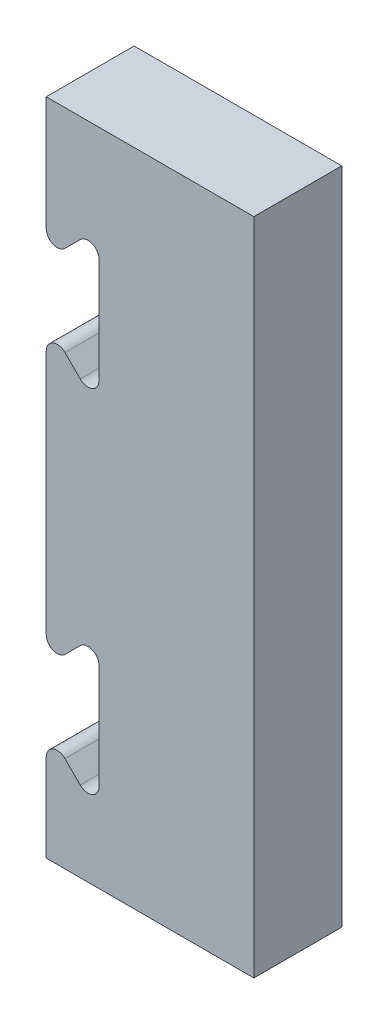
ISO-10303-21;
HEADER;
FILE_DESCRIPTION(('STEP AP214'),'2;1');
FILE_NAME('part.step','',(''),(''),'','','');
FILE_SCHEMA(('AUTOMOTIVE_DESIGN { 1 0 10303 214 1 1 1 1 }'));
ENDSEC;
DATA;
#1=APPLICATION_CONTEXT('core data for automotive mechanical design processes');
#2=APPLICATION_PROTOCOL_DEFINITION('international standard','automotive_design',2000,#1);
#3=PRODUCT_CONTEXT('',#1,'mechanical');
#4=PRODUCT('Part','Part','',(#3));
#5=PRODUCT_RELATED_PRODUCT_CATEGORY('part','',(#4));
#6=PRODUCT_DEFINITION_FORMATION('','',#4);
#7=PRODUCT_DEFINITION_CONTEXT('part definition',#1,'design');
#8=PRODUCT_DEFINITION('design','',#6,#7);
#9=PRODUCT_DEFINITION_SHAPE('','',#8);
#10=(LENGTH_UNIT() NAMED_UNIT(*) SI_UNIT(.MILLI.,.METRE.));
#11=(NAMED_UNIT(*) PLANE_ANGLE_UNIT() SI_UNIT($,.RADIAN.));
#12=(NAMED_UNIT(*) SI_UNIT($,.STERADIAN.) SOLID_ANGLE_UNIT());
#13=UNCERTAINTY_MEASURE_WITH_UNIT(LENGTH_MEASURE(1.E-05),#10,'distance_accuracy_value','');
#14=(GEOMETRIC_REPRESENTATION_CONTEXT(3) GLOBAL_UNCERTAINTY_ASSIGNED_CONTEXT((#13)) GLOBAL_UNIT_ASSIGNED_CONTEXT((#10,
#11,#12)) REPRESENTATION_CONTEXT('',''));
#15=CARTESIAN_POINT('',(0.,0.,0.));
#16=DIRECTION('',(0.,0.,1.));
#17=DIRECTION('',(1.,0.,0.));
#18=AXIS2_PLACEMENT_3D('',#15,#16,#17);
#19=CARTESIAN_POINT('',(0.,0.,-10.));
#20=DIRECTION('',(0.,-1.,0.));
#21=DIRECTION('',(0.,0.,-1.));
#22=AXIS2_PLACEMENT_3D('',#19,#20,#21);
#23=PLANE('',#22);
#24=DIRECTION('',(0.,0.,1.));
#25=VECTOR('',#24,1.);
#26=CARTESIAN_POINT('',(23.6143862190611,0.,-191.676734449803));
#27=LINE('',#26,#25);
#28=CARTESIAN_POINT('',(23.6143862190611,0.,-10.));
#29=VERTEX_POINT('',#28);
#30=CARTESIAN_POINT('',(23.6143862190611,0.,0.));
#31=VERTEX_POINT('',#30);
#32=EDGE_CURVE('E214',#29,#31,#27,.T.);
#33=ORIENTED_EDGE('',*,*,#32,.T.);
#34=DIRECTION('',(1.,0.,0.));
#35=VECTOR('',#34,1.);
#36=CARTESIAN_POINT('',(0.,0.,0.));
#37=LINE('',#36,#35);
#38=CARTESIAN_POINT('',(0.,0.,0.));
#39=VERTEX_POINT('',#38);
#40=EDGE_CURVE('E210',#39,#31,#37,.T.);
#41=ORIENTED_EDGE('',*,*,#40,.F.);
#42=DIRECTION('',(0.,0.,1.));
#43=VECTOR('',#42,1.);
#44=CARTESIAN_POINT('',(0.,0.,-10.));
#45=LINE('',#44,#43);
#46=CARTESIAN_POINT('',(0.,0.,-10.));
#47=VERTEX_POINT('',#46);
#48=EDGE_CURVE('E198',#47,#39,#45,.T.);
#49=ORIENTED_EDGE('',*,*,#48,.F.);
#50=DIRECTION('',(1.,0.,0.));
#51=VECTOR('',#50,1.);
#52=CARTESIAN_POINT('',(0.,0.,-10.));
#53=LINE('',#52,#51);
#54=EDGE_CURVE('E209',#47,#29,#53,.T.);
#55=ORIENTED_EDGE('',*,*,#54,.T.);
#56=EDGE_LOOP('',(#33,#41,#49,#55));
#57=FACE_BOUND('',#56,.T.);
#58=ADVANCED_FACE('F34',(#57),#23,.T.);
#59=CARTESIAN_POINT('',(0.,120.,-10.));
#60=DIRECTION('',(-1.,0.,0.));
#61=DIRECTION('',(0.,-1.,0.));
#62=AXIS2_PLACEMENT_3D('',#59,#60,#61);
#63=PLANE('',#62);
#64=DIRECTION('',(0.,-1.,0.));
#65=VECTOR('',#64,1.);
#66=CARTESIAN_POINT('',(0.,120.,0.));
#67=LINE('',#66,#65);
#68=CARTESIAN_POINT('',(0.,9.98223304703363,0.));
#69=VERTEX_POINT('',#68);
#70=EDGE_CURVE('E82',#69,#39,#67,.T.);
#71=ORIENTED_EDGE('',*,*,#70,.F.);
#72=DIRECTION('',(0.,0.,1.));
#73=VECTOR('',#72,1.);
#74=CARTESIAN_POINT('',(0.,9.98223304703363,-10.));
#75=LINE('',#74,#73);
#76=CARTESIAN_POINT('',(0.,9.98223304703363,-10.));
#77=VERTEX_POINT('',#76);
#78=EDGE_CURVE('E193',#69,#77,#75,.F.);
#79=ORIENTED_EDGE('',*,*,#78,.T.);
#80=DIRECTION('',(0.,-1.,0.));
#81=VECTOR('',#80,1.);
#82=CARTESIAN_POINT('',(0.,120.,-10.));
#83=LINE('',#82,#81);
#84=EDGE_CURVE('E195',#77,#47,#83,.T.);
#85=ORIENTED_EDGE('',*,*,#84,.T.);
#86=ORIENTED_EDGE('',*,*,#48,.T.);
#87=EDGE_LOOP('',(#71,#79,#85,#86));
#88=FACE_BOUND('',#87,.T.);
#89=ADVANCED_FACE('F197',(#88),#63,.T.);
#90=CARTESIAN_POINT('',(1.25,9.98223304703363,-10.));
#91=DIRECTION('',(0.,0.,-1.));
#92=DIRECTION('',(-1.,0.,0.));
#93=AXIS2_PLACEMENT_3D('',#90,#91,#92);
#94=CYLINDRICAL_SURFACE('',#93,1.25);
#95=CARTESIAN_POINT('',(1.25,9.98223304703363,-10.));
#96=DIRECTION('',(0.,0.,1.));
#97=DIRECTION('',(1.,0.,0.));
#98=AXIS2_PLACEMENT_3D('',#95,#96,#97);
#99=CIRCLE('',#98,1.25);
#100=CARTESIAN_POINT('',(2.13388347648318,10.8661165235168,-10.));
#101=VERTEX_POINT('',#100);
#102=EDGE_CURVE('E270',#77,#101,#99,.F.);
#103=ORIENTED_EDGE('',*,*,#102,.F.);
#104=ORIENTED_EDGE('',*,*,#78,.F.);
#105=CARTESIAN_POINT('',(1.25,9.98223304703363,0.));
#106=DIRECTION('',(0.,0.,1.));
#107=DIRECTION('',(1.,0.,0.));
#108=AXIS2_PLACEMENT_3D('',#105,#106,#107);
#109=CIRCLE('',#108,1.25);
#110=CARTESIAN_POINT('',(2.13388347648318,10.8661165235168,0.));
#111=VERTEX_POINT('',#110);
#112=EDGE_CURVE('E90',#111,#69,#109,.T.);
#113=ORIENTED_EDGE('',*,*,#112,.F.);
#114=DIRECTION('',(0.,0.,1.));
#115=VECTOR('',#114,1.);
#116=CARTESIAN_POINT('',(2.13388347648318,10.8661165235168,0.));
#117=LINE('',#116,#115);
#118=EDGE_CURVE('E255',#101,#111,#117,.T.);
#119=ORIENTED_EDGE('',*,*,#118,.F.);
#120=EDGE_LOOP('',(#103,#104,#113,#119));
#121=FACE_BOUND('',#120,.T.);
#122=ADVANCED_FACE('F377',(#121),#94,.T.);
#123=CARTESIAN_POINT('',(0.,13.,-10.));
#124=DIRECTION('',(-0.707106781186548,-0.707106781186547,0.));
#125=DIRECTION('',(0.707106781186547,-0.707106781186548,0.));
#126=AXIS2_PLACEMENT_3D('',#123,#124,#125);
#127=PLANE('',#126);
#128=DIRECTION('',(0.707106781186547,-0.707106781186548,0.));
#129=VECTOR('',#128,1.);
#130=CARTESIAN_POINT('',(0.,13.,0.));
#131=LINE('',#130,#129);
#132=CARTESIAN_POINT('',(3.86611652351681,9.13388347648318,0.));
#133=VERTEX_POINT('',#132);
#134=EDGE_CURVE('E211',#111,#133,#131,.T.);
#135=ORIENTED_EDGE('',*,*,#134,.T.);
#136=DIRECTION('',(0.,0.,1.));
#137=VECTOR('',#136,1.);
#138=CARTESIAN_POINT('',(3.86611652351681,9.13388347648318,-10.));
#139=LINE('',#138,#137);
#140=CARTESIAN_POINT('',(3.86611652351681,9.13388347648318,-10.));
#141=VERTEX_POINT('',#140);
#142=EDGE_CURVE('E258',#133,#141,#139,.F.);
#143=ORIENTED_EDGE('',*,*,#142,.T.);
#144=DIRECTION('',(0.707106781186547,-0.707106781186548,0.));
#145=VECTOR('',#144,1.);
#146=CARTESIAN_POINT('',(0.,13.,-10.));
#147=LINE('',#146,#145);
#148=EDGE_CURVE('E268',#101,#141,#147,.T.);
#149=ORIENTED_EDGE('',*,*,#148,.F.);
#150=ORIENTED_EDGE('',*,*,#118,.T.);
#151=EDGE_LOOP('',(#135,#143,#149,#150));
#152=FACE_BOUND('',#151,.T.);
#153=ADVANCED_FACE('F389',(#152),#127,.F.);
#154=CARTESIAN_POINT('',(4.75,10.0177669529664,-10.));
#155=DIRECTION('',(0.,0.,-1.));
#156=DIRECTION('',(-1.,0.,0.));
#157=AXIS2_PLACEMENT_3D('',#154,#155,#156);
#158=CYLINDRICAL_SURFACE('',#157,1.25);
#159=CARTESIAN_POINT('',(4.75,10.0177669529664,-10.));
#160=DIRECTION('',(0.,0.,1.));
#161=DIRECTION('',(1.,0.,0.));
#162=AXIS2_PLACEMENT_3D('',#159,#160,#161);
#163=CIRCLE('',#162,1.25);
#164=CARTESIAN_POINT('',(6.,10.0177669529664,-10.));
#165=VERTEX_POINT('',#164);
#166=EDGE_CURVE('E267',#141,#165,#163,.T.);
#167=ORIENTED_EDGE('',*,*,#166,.F.);
#168=ORIENTED_EDGE('',*,*,#142,.F.);
#169=CARTESIAN_POINT('',(4.75,10.0177669529664,0.));
#170=DIRECTION('',(0.,0.,1.));
#171=DIRECTION('',(1.,0.,0.));
#172=AXIS2_PLACEMENT_3D('',#169,#170,#171);
#173=CIRCLE('',#172,1.25);
#174=CARTESIAN_POINT('',(6.,10.0177669529664,0.));
#175=VERTEX_POINT('',#174);
#176=EDGE_CURVE('E301',#175,#133,#173,.F.);
#177=ORIENTED_EDGE('',*,*,#176,.F.);
#178=DIRECTION('',(0.,0.,1.));
#179=VECTOR('',#178,1.);
#180=CARTESIAN_POINT('',(6.,10.0177669529664,0.));
#181=LINE('',#180,#179);
#182=EDGE_CURVE('E313',#165,#175,#181,.T.);
#183=ORIENTED_EDGE('',*,*,#182,.F.);
#184=EDGE_LOOP('',(#167,#168,#177,#183));
#185=FACE_BOUND('',#184,.T.);
#186=ADVANCED_FACE('F392',(#185),#158,.F.);
#187=CARTESIAN_POINT('',(6.,6.99999999999999,-10.));
#188=DIRECTION('',(1.,0.,0.));
#189=DIRECTION('',(0.,0.,-1.));
#190=AXIS2_PLACEMENT_3D('',#187,#188,#189);
#191=PLANE('',#190);
#192=DIRECTION('',(0.,1.,0.));
#193=VECTOR('',#192,1.);
#194=CARTESIAN_POINT('',(6.,6.99999999999999,0.));
#195=LINE('',#194,#193);
#196=CARTESIAN_POINT('',(6.,21.9822330470336,0.));
#197=VERTEX_POINT('',#196);
#198=EDGE_CURVE('E251',#175,#197,#195,.T.);
#199=ORIENTED_EDGE('',*,*,#198,.T.);
#200=DIRECTION('',(0.,0.,1.));
#201=VECTOR('',#200,1.);
#202=CARTESIAN_POINT('',(6.,21.9822330470336,-10.));
#203=LINE('',#202,#201);
#204=CARTESIAN_POINT('',(6.,21.9822330470336,-10.));
#205=VERTEX_POINT('',#204);
#206=EDGE_CURVE('E254',#197,#205,#203,.F.);
#207=ORIENTED_EDGE('',*,*,#206,.T.);
#208=DIRECTION('',(0.,1.,0.));
#209=VECTOR('',#208,1.);
#210=CARTESIAN_POINT('',(6.,6.99999999999999,-10.));
#211=LINE('',#210,#209);
#212=EDGE_CURVE('E264',#165,#205,#211,.T.);
#213=ORIENTED_EDGE('',*,*,#212,.F.);
#214=ORIENTED_EDGE('',*,*,#182,.T.);
#215=EDGE_LOOP('',(#199,#207,#213,#214));
#216=FACE_BOUND('',#215,.T.);
#217=ADVANCED_FACE('F394',(#216),#191,.F.);
#218=CARTESIAN_POINT('',(4.75,21.9822330470336,-10.));
#219=DIRECTION('',(0.,0.,-1.));
#220=DIRECTION('',(-1.,0.,0.));
#221=AXIS2_PLACEMENT_3D('',#218,#219,#220);
#222=CYLINDRICAL_SURFACE('',#221,1.25);
#223=CARTESIAN_POINT('',(4.75,21.9822330470336,-10.));
#224=DIRECTION('',(0.,0.,1.));
#225=DIRECTION('',(1.,0.,0.));
#226=AXIS2_PLACEMENT_3D('',#223,#224,#225);
#227=CIRCLE('',#226,1.25);
#228=CARTESIAN_POINT('',(3.86611652351681,22.8661165235168,-10.));
#229=VERTEX_POINT('',#228);
#230=EDGE_CURVE('E263',#205,#229,#227,.T.);
#231=ORIENTED_EDGE('',*,*,#230,.F.);
#232=ORIENTED_EDGE('',*,*,#206,.F.);
#233=CARTESIAN_POINT('',(4.75,21.9822330470336,0.));
#234=DIRECTION('',(0.,0.,1.));
#235=DIRECTION('',(1.,0.,0.));
#236=AXIS2_PLACEMENT_3D('',#233,#234,#235);
#237=CIRCLE('',#236,1.25);
#238=CARTESIAN_POINT('',(3.86611652351681,22.8661165235168,0.));
#239=VERTEX_POINT('',#238);
#240=EDGE_CURVE('E303',#239,#197,#237,.F.);
#241=ORIENTED_EDGE('',*,*,#240,.F.);
#242=DIRECTION('',(0.,0.,1.));
#243=VECTOR('',#242,1.);
#244=CARTESIAN_POINT('',(3.86611652351681,22.8661165235168,0.));
#245=LINE('',#244,#243);
#246=EDGE_CURVE('E250',#229,#239,#245,.T.);
#247=ORIENTED_EDGE('',*,*,#246,.F.);
#248=EDGE_LOOP('',(#231,#232,#241,#247));
#249=FACE_BOUND('',#248,.T.);
#250=ADVANCED_FACE('F380',(#249),#222,.F.);
#251=CARTESIAN_POINT('',(6.,25.,-10.));
#252=DIRECTION('',(-0.707106781186547,0.707106781186548,0.));
#253=DIRECTION('',(-0.707106781186548,-0.707106781186547,0.));
#254=AXIS2_PLACEMENT_3D('',#251,#252,#253);
#255=PLANE('',#254);
#256=DIRECTION('',(-0.707106781186548,-0.707106781186547,0.));
#257=VECTOR('',#256,1.);
#258=CARTESIAN_POINT('',(6.,25.,-10.));
#259=LINE('',#258,#257);
#260=CARTESIAN_POINT('',(2.13388347648318,21.1338834764832,-10.));
#261=VERTEX_POINT('',#260);
#262=EDGE_CURVE('E259',#229,#261,#259,.T.);
#263=ORIENTED_EDGE('',*,*,#262,.F.);
#264=ORIENTED_EDGE('',*,*,#246,.T.);
#265=DIRECTION('',(-0.707106781186548,-0.707106781186547,0.));
#266=VECTOR('',#265,1.);
#267=CARTESIAN_POINT('',(6.,25.,0.));
#268=LINE('',#267,#266);
#269=CARTESIAN_POINT('',(2.13388347648318,21.1338834764832,0.));
#270=VERTEX_POINT('',#269);
#271=EDGE_CURVE('E247',#239,#270,#268,.T.);
#272=ORIENTED_EDGE('',*,*,#271,.T.);
#273=DIRECTION('',(0.,0.,1.));
#274=VECTOR('',#273,1.);
#275=CARTESIAN_POINT('',(2.13388347648318,21.1338834764832,-10.));
#276=LINE('',#275,#274);
#277=EDGE_CURVE('E249',#270,#261,#276,.F.);
#278=ORIENTED_EDGE('',*,*,#277,.T.);
#279=EDGE_LOOP('',(#263,#264,#272,#278));
#280=FACE_BOUND('',#279,.T.);
#281=ADVANCED_FACE('F398',(#280),#255,.F.);
#282=CARTESIAN_POINT('',(1.25,22.0177669529664,-10.));
#283=DIRECTION('',(0.,0.,-1.));
#284=DIRECTION('',(-1.,0.,0.));
#285=AXIS2_PLACEMENT_3D('',#282,#283,#284);
#286=CYLINDRICAL_SURFACE('',#285,1.25);
#287=CARTESIAN_POINT('',(1.25,22.0177669529664,-10.));
#288=DIRECTION('',(0.,0.,1.));
#289=DIRECTION('',(1.,0.,0.));
#290=AXIS2_PLACEMENT_3D('',#287,#288,#289);
#291=CIRCLE('',#290,1.25);
#292=CARTESIAN_POINT('',(0.,22.0177669529664,-10.));
#293=VERTEX_POINT('',#292);
#294=EDGE_CURVE('E262',#261,#293,#291,.F.);
#295=ORIENTED_EDGE('',*,*,#294,.F.);
#296=ORIENTED_EDGE('',*,*,#277,.F.);
#297=CARTESIAN_POINT('',(1.25,22.0177669529664,0.));
#298=DIRECTION('',(0.,0.,1.));
#299=DIRECTION('',(1.,0.,0.));
#300=AXIS2_PLACEMENT_3D('',#297,#298,#299);
#301=CIRCLE('',#300,1.25);
#302=CARTESIAN_POINT('',(0.,22.0177669529664,0.));
#303=VERTEX_POINT('',#302);
#304=EDGE_CURVE('E130',#303,#270,#301,.T.);
#305=ORIENTED_EDGE('',*,*,#304,.F.);
#306=DIRECTION('',(0.,0.,1.));
#307=VECTOR('',#306,1.);
#308=CARTESIAN_POINT('',(0.,22.0177669529664,0.));
#309=LINE('',#308,#307);
#310=EDGE_CURVE('E291',#293,#303,#309,.T.);
#311=ORIENTED_EDGE('',*,*,#310,.F.);
#312=EDGE_LOOP('',(#295,#296,#305,#311));
#313=FACE_BOUND('',#312,.T.);
#314=ADVANCED_FACE('F401',(#313),#286,.T.);
#315=CARTESIAN_POINT('',(0.,49.9822330470336,-10.));
#316=VERTEX_POINT('',#315);
#317=EDGE_CURVE('E205',#316,#293,#83,.T.);
#318=ORIENTED_EDGE('',*,*,#317,.T.);
#319=ORIENTED_EDGE('',*,*,#310,.T.);
#320=CARTESIAN_POINT('',(0.,49.9822330470336,0.));
#321=VERTEX_POINT('',#320);
#322=EDGE_CURVE('E219',#321,#303,#67,.T.);
#323=ORIENTED_EDGE('',*,*,#322,.F.);
#324=DIRECTION('',(0.,0.,1.));
#325=VECTOR('',#324,1.);
#326=CARTESIAN_POINT('',(0.,49.9822330470336,-10.));
#327=LINE('',#326,#325);
#328=EDGE_CURVE('E226',#321,#316,#327,.F.);
#329=ORIENTED_EDGE('',*,*,#328,.T.);
#330=EDGE_LOOP('',(#318,#319,#323,#329));
#331=FACE_BOUND('',#330,.T.);
#332=ADVANCED_FACE('F324',(#331),#63,.T.);
#333=CARTESIAN_POINT('',(1.25,49.9822330470336,-10.));
#334=DIRECTION('',(0.,0.,-1.));
#335=DIRECTION('',(-1.,0.,0.));
#336=AXIS2_PLACEMENT_3D('',#333,#334,#335);
#337=CYLINDRICAL_SURFACE('',#336,1.25);
#338=CARTESIAN_POINT('',(1.25,49.9822330470336,-10.));
#339=DIRECTION('',(0.,0.,1.));
#340=DIRECTION('',(1.,0.,0.));
#341=AXIS2_PLACEMENT_3D('',#338,#339,#340);
#342=CIRCLE('',#341,1.25);
#343=CARTESIAN_POINT('',(2.13388347648318,50.8661165235168,-10.));
#344=VERTEX_POINT('',#343);
#345=EDGE_CURVE('E239',#316,#344,#342,.F.);
#346=ORIENTED_EDGE('',*,*,#345,.F.);
#347=ORIENTED_EDGE('',*,*,#328,.F.);
#348=CARTESIAN_POINT('',(1.25,49.9822330470336,0.));
#349=DIRECTION('',(0.,0.,1.));
#350=DIRECTION('',(1.,0.,0.));
#351=AXIS2_PLACEMENT_3D('',#348,#349,#350);
#352=CIRCLE('',#351,1.25);
#353=CARTESIAN_POINT('',(2.13388347648318,50.8661165235168,0.));
#354=VERTEX_POINT('',#353);
#355=EDGE_CURVE('E137',#354,#321,#352,.T.);
#356=ORIENTED_EDGE('',*,*,#355,.F.);
#357=DIRECTION('',(0.,0.,1.));
#358=VECTOR('',#357,1.);
#359=CARTESIAN_POINT('',(2.13388347648318,50.8661165235168,0.));
#360=LINE('',#359,#358);
#361=EDGE_CURVE('E285',#344,#354,#360,.T.);
#362=ORIENTED_EDGE('',*,*,#361,.F.);
#363=EDGE_LOOP('',(#346,#347,#356,#362));
#364=FACE_BOUND('',#363,.T.);
#365=ADVANCED_FACE('F329',(#364),#337,.T.);
#366=CARTESIAN_POINT('',(6.,47.,-10.));
#367=DIRECTION('',(-0.707106781186547,-0.707106781186548,0.));
#368=DIRECTION('',(0.707106781186548,-0.707106781186547,0.));
#369=AXIS2_PLACEMENT_3D('',#366,#367,#368);
#370=PLANE('',#369);
#371=DIRECTION('',(0.707106781186548,-0.707106781186547,0.));
#372=VECTOR('',#371,1.);
#373=CARTESIAN_POINT('',(6.,47.,0.));
#374=LINE('',#373,#372);
#375=CARTESIAN_POINT('',(3.86611652351681,49.1338834764832,0.));
#376=VERTEX_POINT('',#375);
#377=EDGE_CURVE('E222',#354,#376,#374,.T.);
#378=ORIENTED_EDGE('',*,*,#377,.T.);
#379=DIRECTION('',(0.,0.,1.));
#380=VECTOR('',#379,1.);
#381=CARTESIAN_POINT('',(3.86611652351681,49.1338834764832,-10.));
#382=LINE('',#381,#380);
#383=CARTESIAN_POINT('',(3.86611652351681,49.1338834764832,-10.));
#384=VERTEX_POINT('',#383);
#385=EDGE_CURVE('E225',#376,#384,#382,.F.);
#386=ORIENTED_EDGE('',*,*,#385,.T.);
#387=DIRECTION('',(0.707106781186548,-0.707106781186547,0.));
#388=VECTOR('',#387,1.);
#389=CARTESIAN_POINT('',(6.,47.,-10.));
#390=LINE('',#389,#388);
#391=EDGE_CURVE('E235',#344,#384,#390,.T.);
#392=ORIENTED_EDGE('',*,*,#391,.F.);
#393=ORIENTED_EDGE('',*,*,#361,.T.);
#394=EDGE_LOOP('',(#378,#386,#392,#393));
#395=FACE_BOUND('',#394,.T.);
#396=ADVANCED_FACE('F334',(#395),#370,.F.);
#397=CARTESIAN_POINT('',(4.75,50.0177669529664,-10.));
#398=DIRECTION('',(0.,0.,-1.));
#399=DIRECTION('',(-1.,0.,0.));
#400=AXIS2_PLACEMENT_3D('',#397,#398,#399);
#401=CYLINDRICAL_SURFACE('',#400,1.25);
#402=CARTESIAN_POINT('',(4.75,50.0177669529664,-10.));
#403=DIRECTION('',(0.,0.,1.));
#404=DIRECTION('',(1.,0.,0.));
#405=AXIS2_PLACEMENT_3D('',#402,#403,#404);
#406=CIRCLE('',#405,1.25);
#407=CARTESIAN_POINT('',(6.,50.0177669529664,-10.));
#408=VERTEX_POINT('',#407);
#409=EDGE_CURVE('E238',#384,#408,#406,.T.);
#410=ORIENTED_EDGE('',*,*,#409,.F.);
#411=ORIENTED_EDGE('',*,*,#385,.F.);
#412=CARTESIAN_POINT('',(4.75,50.0177669529664,0.));
#413=DIRECTION('',(0.,0.,1.));
#414=DIRECTION('',(1.,0.,0.));
#415=AXIS2_PLACEMENT_3D('',#412,#413,#414);
#416=CIRCLE('',#415,1.25);
#417=CARTESIAN_POINT('',(6.,50.0177669529664,0.));
#418=VERTEX_POINT('',#417);
#419=EDGE_CURVE('E305',#418,#376,#416,.F.);
#420=ORIENTED_EDGE('',*,*,#419,.F.);
#421=DIRECTION('',(0.,0.,1.));
#422=VECTOR('',#421,1.);
#423=CARTESIAN_POINT('',(6.,50.0177669529664,0.));
#424=LINE('',#423,#422);
#425=EDGE_CURVE('E234',#408,#418,#424,.T.);
#426=ORIENTED_EDGE('',*,*,#425,.F.);
#427=EDGE_LOOP('',(#410,#411,#420,#426));
#428=FACE_BOUND('',#427,.T.);
#429=ADVANCED_FACE('F337',(#428),#401,.F.);
#430=CARTESIAN_POINT('',(6.,65.,-10.));
#431=DIRECTION('',(1.,0.,0.));
#432=DIRECTION('',(0.,0.,-1.));
#433=AXIS2_PLACEMENT_3D('',#430,#431,#432);
#434=PLANE('',#433);
#435=DIRECTION('',(0.,1.,0.));
#436=VECTOR('',#435,1.);
#437=CARTESIAN_POINT('',(6.,65.,-10.));
#438=LINE('',#437,#436);
#439=CARTESIAN_POINT('',(6.,61.9822330470336,-10.));
#440=VERTEX_POINT('',#439);
#441=EDGE_CURVE('E245',#408,#440,#438,.T.);
#442=ORIENTED_EDGE('',*,*,#441,.F.);
#443=ORIENTED_EDGE('',*,*,#425,.T.);
#444=DIRECTION('',(0.,1.,0.));
#445=VECTOR('',#444,1.);
#446=CARTESIAN_POINT('',(6.,65.,0.));
#447=LINE('',#446,#445);
#448=CARTESIAN_POINT('',(6.,61.9822330470336,0.));
#449=VERTEX_POINT('',#448);
#450=EDGE_CURVE('E232',#418,#449,#447,.T.);
#451=ORIENTED_EDGE('',*,*,#450,.T.);
#452=DIRECTION('',(0.,0.,1.));
#453=VECTOR('',#452,1.);
#454=CARTESIAN_POINT('',(6.,61.9822330470336,-10.));
#455=LINE('',#454,#453);
#456=EDGE_CURVE('E173',#449,#440,#455,.F.);
#457=ORIENTED_EDGE('',*,*,#456,.T.);
#458=EDGE_LOOP('',(#442,#443,#451,#457));
#459=FACE_BOUND('',#458,.T.);
#460=ADVANCED_FACE('F384',(#459),#434,.F.);
#461=CARTESIAN_POINT('',(4.75,61.9822330470336,-10.));
#462=DIRECTION('',(0.,0.,-1.));
#463=DIRECTION('',(-1.,0.,0.));
#464=AXIS2_PLACEMENT_3D('',#461,#462,#463);
#465=CYLINDRICAL_SURFACE('',#464,1.25);
#466=CARTESIAN_POINT('',(4.75,61.9822330470336,-10.));
#467=DIRECTION('',(0.,0.,1.));
#468=DIRECTION('',(1.,0.,0.));
#469=AXIS2_PLACEMENT_3D('',#466,#467,#468);
#470=CIRCLE('',#469,1.25);
#471=CARTESIAN_POINT('',(3.86611652351681,62.8661165235168,-10.));
#472=VERTEX_POINT('',#471);
#473=EDGE_CURVE('E244',#440,#472,#470,.T.);
#474=ORIENTED_EDGE('',*,*,#473,.F.);
#475=ORIENTED_EDGE('',*,*,#456,.F.);
#476=CARTESIAN_POINT('',(4.75,61.9822330470336,0.));
#477=DIRECTION('',(0.,0.,1.));
#478=DIRECTION('',(1.,0.,0.));
#479=AXIS2_PLACEMENT_3D('',#476,#477,#478);
#480=CIRCLE('',#479,1.25);
#481=CARTESIAN_POINT('',(3.86611652351681,62.8661165235168,0.));
#482=VERTEX_POINT('',#481);
#483=EDGE_CURVE('E164',#482,#449,#480,.F.);
#484=ORIENTED_EDGE('',*,*,#483,.F.);
#485=DIRECTION('',(0.,0.,1.));
#486=VECTOR('',#485,1.);
#487=CARTESIAN_POINT('',(3.86611652351682,62.8661165235168,0.));
#488=LINE('',#487,#486);
#489=EDGE_CURVE('E231',#472,#482,#488,.T.);
#490=ORIENTED_EDGE('',*,*,#489,.F.);
#491=EDGE_LOOP('',(#474,#475,#484,#490));
#492=FACE_BOUND('',#491,.T.);
#493=ADVANCED_FACE('F367',(#492),#465,.F.);
#494=CARTESIAN_POINT('',(0.,59.,-10.));
#495=DIRECTION('',(-0.707106781186548,0.707106781186547,0.));
#496=DIRECTION('',(-0.707106781186547,-0.707106781186548,0.));
#497=AXIS2_PLACEMENT_3D('',#494,#495,#496);
#498=PLANE('',#497);
#499=DIRECTION('',(-0.707106781186547,-0.707106781186548,0.));
#500=VECTOR('',#499,1.);
#501=CARTESIAN_POINT('',(0.,59.,-10.));
#502=LINE('',#501,#500);
#503=CARTESIAN_POINT('',(2.13388347648318,61.1338834764832,-10.));
#504=VERTEX_POINT('',#503);
#505=EDGE_CURVE('E240',#472,#504,#502,.T.);
#506=ORIENTED_EDGE('',*,*,#505,.F.);
#507=ORIENTED_EDGE('',*,*,#489,.T.);
#508=DIRECTION('',(-0.707106781186547,-0.707106781186548,0.));
#509=VECTOR('',#508,1.);
#510=CARTESIAN_POINT('',(0.,59.,0.));
#511=LINE('',#510,#509);
#512=CARTESIAN_POINT('',(2.13388347648318,61.1338834764832,0.));
#513=VERTEX_POINT('',#512);
#514=EDGE_CURVE('E227',#482,#513,#511,.T.);
#515=ORIENTED_EDGE('',*,*,#514,.T.);
#516=DIRECTION('',(0.,0.,1.));
#517=VECTOR('',#516,1.);
#518=CARTESIAN_POINT('',(2.13388347648318,61.1338834764832,-10.));
#519=LINE('',#518,#517);
#520=EDGE_CURVE('E230',#513,#504,#519,.F.);
#521=ORIENTED_EDGE('',*,*,#520,.T.);
#522=EDGE_LOOP('',(#506,#507,#515,#521));
#523=FACE_BOUND('',#522,.T.);
#524=ADVANCED_FACE('F360',(#523),#498,.F.);
#525=CARTESIAN_POINT('',(1.25,62.0177669529664,-10.));
#526=DIRECTION('',(0.,0.,-1.));
#527=DIRECTION('',(-1.,0.,0.));
#528=AXIS2_PLACEMENT_3D('',#525,#526,#527);
#529=CYLINDRICAL_SURFACE('',#528,1.25);
#530=CARTESIAN_POINT('',(1.25,62.0177669529664,-10.));
#531=DIRECTION('',(0.,0.,1.));
#532=DIRECTION('',(1.,0.,0.));
#533=AXIS2_PLACEMENT_3D('',#530,#531,#532);
#534=CIRCLE('',#533,1.25);
#535=CARTESIAN_POINT('',(0.,62.0177669529664,-10.));
#536=VERTEX_POINT('',#535);
#537=EDGE_CURVE('E243',#504,#536,#534,.F.);
#538=ORIENTED_EDGE('',*,*,#537,.F.);
#539=ORIENTED_EDGE('',*,*,#520,.F.);
#540=CARTESIAN_POINT('',(1.25,62.0177669529664,0.));
#541=DIRECTION('',(0.,0.,1.));
#542=DIRECTION('',(1.,0.,0.));
#543=AXIS2_PLACEMENT_3D('',#540,#541,#542);
#544=CIRCLE('',#543,1.25);
#545=CARTESIAN_POINT('',(0.,62.0177669529664,0.));
#546=VERTEX_POINT('',#545);
#547=EDGE_CURVE('E306',#546,#513,#544,.T.);
#548=ORIENTED_EDGE('',*,*,#547,.F.);
#549=DIRECTION('',(0.,0.,1.));
#550=VECTOR('',#549,1.);
#551=CARTESIAN_POINT('',(0.,62.0177669529664,0.));
#552=LINE('',#551,#550);
#553=EDGE_CURVE('E216',#536,#546,#552,.T.);
#554=ORIENTED_EDGE('',*,*,#553,.F.);
#555=EDGE_LOOP('',(#538,#539,#548,#554));
#556=FACE_BOUND('',#555,.T.);
#557=ADVANCED_FACE('F358',(#556),#529,.T.);
#558=CARTESIAN_POINT('',(0.,0.,-10.));
#559=DIRECTION('',(0.,0.,1.));
#560=DIRECTION('',(1.,0.,0.));
#561=AXIS2_PLACEMENT_3D('',#558,#559,#560);
#562=PLANE('',#561);
#563=DIRECTION('',(0.,-1.,0.));
#564=VECTOR('',#563,1.);
#565=CARTESIAN_POINT('',(23.6143862190611,0.,-10.));
#566=LINE('',#565,#564);
#567=CARTESIAN_POINT('',(23.6143862190611,75.,-10.));
#568=VERTEX_POINT('',#567);
#569=EDGE_CURVE('E52',#568,#29,#566,.T.);
#570=ORIENTED_EDGE('',*,*,#569,.T.);
#571=ORIENTED_EDGE('',*,*,#54,.F.);
#572=ORIENTED_EDGE('',*,*,#84,.F.);
#573=ORIENTED_EDGE('',*,*,#102,.T.);
#574=ORIENTED_EDGE('',*,*,#148,.T.);
#575=ORIENTED_EDGE('',*,*,#166,.T.);
#576=ORIENTED_EDGE('',*,*,#212,.T.);
#577=ORIENTED_EDGE('',*,*,#230,.T.);
#578=ORIENTED_EDGE('',*,*,#262,.T.);
#579=ORIENTED_EDGE('',*,*,#294,.T.);
#580=ORIENTED_EDGE('',*,*,#317,.F.);
#581=ORIENTED_EDGE('',*,*,#345,.T.);
#582=ORIENTED_EDGE('',*,*,#391,.T.);
#583=ORIENTED_EDGE('',*,*,#409,.T.);
#584=ORIENTED_EDGE('',*,*,#441,.T.);
#585=ORIENTED_EDGE('',*,*,#473,.T.);
#586=ORIENTED_EDGE('',*,*,#505,.T.);
#587=ORIENTED_EDGE('',*,*,#537,.T.);
#588=CARTESIAN_POINT('',(0.,75.,-10.));
#589=VERTEX_POINT('',#588);
#590=EDGE_CURVE('E204',#589,#536,#83,.T.);
#591=ORIENTED_EDGE('',*,*,#590,.F.);
#592=DIRECTION('',(1.,0.,0.));
#593=VECTOR('',#592,1.);
#594=CARTESIAN_POINT('',(0.,75.,-10.));
#595=LINE('',#594,#593);
#596=EDGE_CURVE('E65',#589,#568,#595,.T.);
#597=ORIENTED_EDGE('',*,*,#596,.T.);
#598=EDGE_LOOP('',(#570,#571,#572,#573,#574,#575,#576,#577,#578,#579,#580,#581,#582,#583,#584,
#585,#586,#587,#591,#597));
#599=FACE_BOUND('',#598,.T.);
#600=ADVANCED_FACE('F213',(#599),#562,.F.);
#601=CARTESIAN_POINT('',(0.,0.,0.));
#602=DIRECTION('',(0.,0.,1.));
#603=DIRECTION('',(1.,0.,0.));
#604=AXIS2_PLACEMENT_3D('',#601,#602,#603);
#605=PLANE('',#604);
#606=ORIENTED_EDGE('',*,*,#40,.T.);
#607=DIRECTION('',(0.,1.,0.));
#608=VECTOR('',#607,1.);
#609=CARTESIAN_POINT('',(23.6143862190611,0.,0.));
#610=LINE('',#609,#608);
#611=CARTESIAN_POINT('',(23.6143862190611,75.,0.));
#612=VERTEX_POINT('',#611);
#613=EDGE_CURVE('E273',#31,#612,#610,.T.);
#614=ORIENTED_EDGE('',*,*,#613,.T.);
#615=DIRECTION('',(1.,0.,0.));
#616=VECTOR('',#615,1.);
#617=CARTESIAN_POINT('',(0.,75.,0.));
#618=LINE('',#617,#616);
#619=CARTESIAN_POINT('',(0.,75.,0.));
#620=VERTEX_POINT('',#619);
#621=EDGE_CURVE('E38',#612,#620,#618,.F.);
#622=ORIENTED_EDGE('',*,*,#621,.T.);
#623=EDGE_CURVE('E308',#620,#546,#67,.T.);
#624=ORIENTED_EDGE('',*,*,#623,.T.);
#625=ORIENTED_EDGE('',*,*,#547,.T.);
#626=ORIENTED_EDGE('',*,*,#514,.F.);
#627=ORIENTED_EDGE('',*,*,#483,.T.);
#628=ORIENTED_EDGE('',*,*,#450,.F.);
#629=ORIENTED_EDGE('',*,*,#419,.T.);
#630=ORIENTED_EDGE('',*,*,#377,.F.);
#631=ORIENTED_EDGE('',*,*,#355,.T.);
#632=ORIENTED_EDGE('',*,*,#322,.T.);
#633=ORIENTED_EDGE('',*,*,#304,.T.);
#634=ORIENTED_EDGE('',*,*,#271,.F.);
#635=ORIENTED_EDGE('',*,*,#240,.T.);
#636=ORIENTED_EDGE('',*,*,#198,.F.);
#637=ORIENTED_EDGE('',*,*,#176,.T.);
#638=ORIENTED_EDGE('',*,*,#134,.F.);
#639=ORIENTED_EDGE('',*,*,#112,.T.);
#640=ORIENTED_EDGE('',*,*,#70,.T.);
#641=EDGE_LOOP('',(#606,#614,#622,#624,#625,#626,#627,#628,#629,#630,#631,#632,#633,#634,#635,
#636,#637,#638,#639,#640));
#642=FACE_BOUND('',#641,.T.);
#643=ADVANCED_FACE('F320',(#642),#605,.T.);
#644=ORIENTED_EDGE('',*,*,#623,.F.);
#645=DIRECTION('',(0.,0.,1.));
#646=VECTOR('',#645,1.);
#647=CARTESIAN_POINT('',(0.,75.,-191.676734449803));
#648=LINE('',#647,#646);
#649=EDGE_CURVE('E44',#589,#620,#648,.T.);
#650=ORIENTED_EDGE('',*,*,#649,.F.);
#651=ORIENTED_EDGE('',*,*,#590,.T.);
#652=ORIENTED_EDGE('',*,*,#553,.T.);
#653=EDGE_LOOP('',(#644,#650,#651,#652));
#654=FACE_BOUND('',#653,.T.);
#655=ADVANCED_FACE('F36',(#654),#63,.T.);
#656=CARTESIAN_POINT('',(0.,75.,-191.676734449803));
#657=DIRECTION('',(0.,1.,0.));
#658=DIRECTION('',(0.,0.,1.));
#659=AXIS2_PLACEMENT_3D('',#656,#657,#658);
#660=PLANE('',#659);
#661=ORIENTED_EDGE('',*,*,#649,.T.);
#662=ORIENTED_EDGE('',*,*,#621,.F.);
#663=DIRECTION('',(0.,0.,1.));
#664=VECTOR('',#663,1.);
#665=CARTESIAN_POINT('',(23.6143862190611,75.,-191.676734449803));
#666=LINE('',#665,#664);
#667=EDGE_CURVE('E12',#568,#612,#666,.T.);
#668=ORIENTED_EDGE('',*,*,#667,.F.);
#669=ORIENTED_EDGE('',*,*,#596,.F.);
#670=EDGE_LOOP('',(#661,#662,#668,#669));
#671=FACE_BOUND('',#670,.T.);
#672=ADVANCED_FACE('F356',(#671),#660,.T.);
#673=CARTESIAN_POINT('',(23.6143862190611,0.,-191.676734449803));
#674=DIRECTION('',(1.,0.,0.));
#675=DIRECTION('',(0.,0.,-1.));
#676=AXIS2_PLACEMENT_3D('',#673,#674,#675);
#677=PLANE('',#676);
#678=ORIENTED_EDGE('',*,*,#667,.T.);
#679=ORIENTED_EDGE('',*,*,#613,.F.);
#680=ORIENTED_EDGE('',*,*,#32,.F.);
#681=ORIENTED_EDGE('',*,*,#569,.F.);
#682=EDGE_LOOP('',(#678,#679,#680,#681));
#683=FACE_BOUND('',#682,.T.);
#684=ADVANCED_FACE('F403',(#683),#677,.T.);
#685=CLOSED_SHELL('',(#58,#89,#122,#153,#186,#217,#250,#281,#314,#332,#365,#396,#429,#460,#493,
#524,#557,#600,#643,#655,#672,#684));
#686=MANIFOLD_SOLID_BREP('B2',#685);
#687=ADVANCED_BREP_SHAPE_REPRESENTATION('',(#18,#686),#14);
#688=SHAPE_DEFINITION_REPRESENTATION(#9,#687);
ENDSEC;
END-ISO-10303-21;
